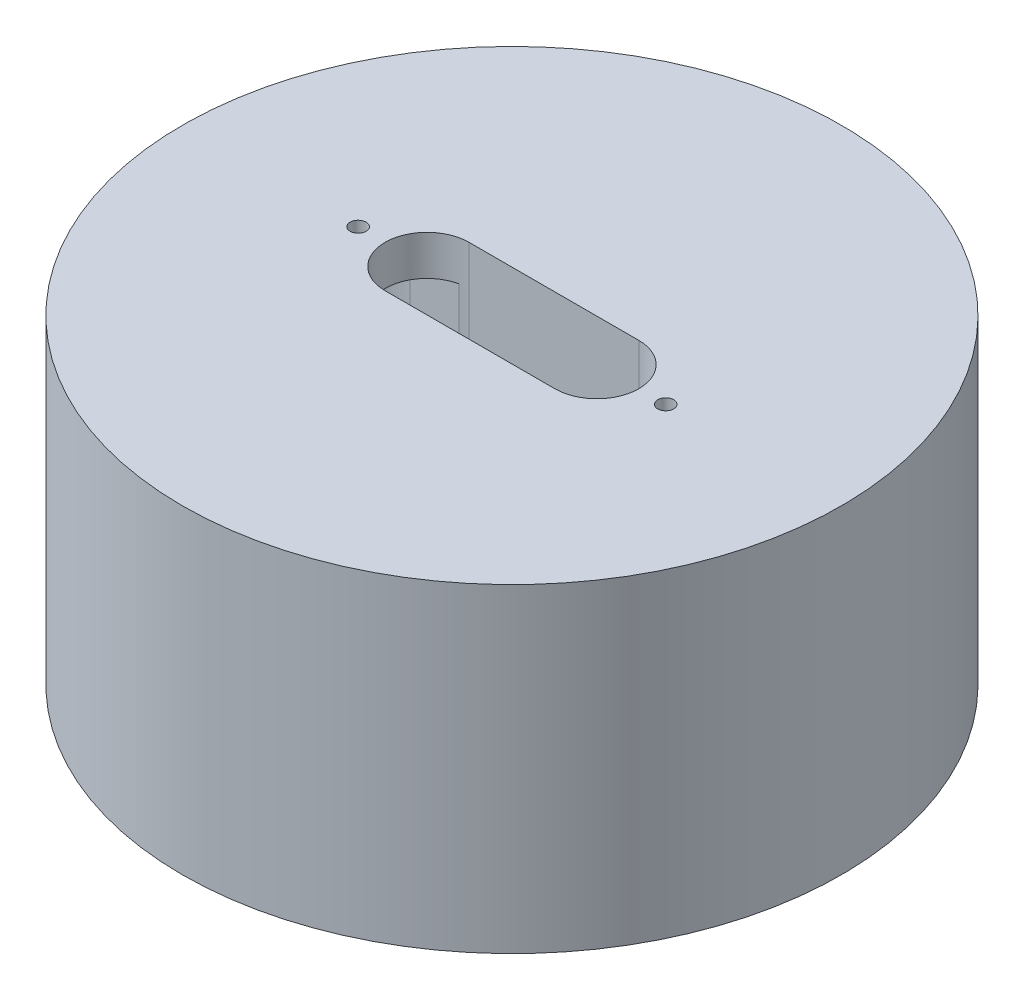
ISO-10303-21;
HEADER;
FILE_DESCRIPTION(('STEP AP214'),'2;1');
FILE_NAME('part.step','',(''),(''),'','','');
FILE_SCHEMA(('AUTOMOTIVE_DESIGN { 1 0 10303 214 1 1 1 1 }'));
ENDSEC;
DATA;
#1=APPLICATION_CONTEXT('core data for automotive mechanical design processes');
#2=APPLICATION_PROTOCOL_DEFINITION('international standard','automotive_design',2000,#1);
#3=PRODUCT_CONTEXT('',#1,'mechanical');
#4=PRODUCT('Part','Part','',(#3));
#5=PRODUCT_RELATED_PRODUCT_CATEGORY('part','',(#4));
#6=PRODUCT_DEFINITION_FORMATION('','',#4);
#7=PRODUCT_DEFINITION_CONTEXT('part definition',#1,'design');
#8=PRODUCT_DEFINITION('design','',#6,#7);
#9=PRODUCT_DEFINITION_SHAPE('','',#8);
#10=(LENGTH_UNIT() NAMED_UNIT(*) SI_UNIT(.MILLI.,.METRE.));
#11=(NAMED_UNIT(*) PLANE_ANGLE_UNIT() SI_UNIT($,.RADIAN.));
#12=(NAMED_UNIT(*) SI_UNIT($,.STERADIAN.) SOLID_ANGLE_UNIT());
#13=UNCERTAINTY_MEASURE_WITH_UNIT(LENGTH_MEASURE(1.E-05),#10,'distance_accuracy_value','');
#14=(GEOMETRIC_REPRESENTATION_CONTEXT(3) GLOBAL_UNCERTAINTY_ASSIGNED_CONTEXT((#13)) GLOBAL_UNIT_ASSIGNED_CONTEXT((#10,
#11,#12)) REPRESENTATION_CONTEXT('',''));
#15=CARTESIAN_POINT('',(0.,0.,0.));
#16=DIRECTION('',(0.,0.,1.));
#17=DIRECTION('',(1.,0.,0.));
#18=AXIS2_PLACEMENT_3D('',#15,#16,#17);
#19=CARTESIAN_POINT('',(0.,0.,0.));
#20=DIRECTION('',(0.,1.,0.));
#21=DIRECTION('',(0.,0.,1.));
#22=AXIS2_PLACEMENT_3D('',#19,#20,#21);
#23=PLANE('',#22);
#24=CARTESIAN_POINT('',(0.,0.,0.));
#25=DIRECTION('',(0.,1.,0.));
#26=DIRECTION('',(0.,0.,1.));
#27=AXIS2_PLACEMENT_3D('',#24,#25,#26);
#28=CIRCLE('',#27,16.5);
#29=CARTESIAN_POINT('',(0.,0.,16.5));
#30=VERTEX_POINT('',#29);
#31=EDGE_CURVE('E331',#30,#30,#28,.T.);
#32=ORIENTED_EDGE('',*,*,#31,.F.);
#33=EDGE_LOOP('',(#32));
#34=FACE_BOUND('',#33,.T.);
#35=CARTESIAN_POINT('',(15.,0.,0.));
#36=DIRECTION('',(0.,-1.,0.));
#37=DIRECTION('',(0.,0.,-1.));
#38=AXIS2_PLACEMENT_3D('',#35,#36,#37);
#39=CIRCLE('',#38,0.4);
#40=CARTESIAN_POINT('',(15.,0.,-0.4));
#41=VERTEX_POINT('',#40);
#42=EDGE_CURVE('E229',#41,#41,#39,.T.);
#43=ORIENTED_EDGE('',*,*,#42,.F.);
#44=EDGE_LOOP('',(#43));
#45=FACE_BOUND('',#44,.T.);
#46=CARTESIAN_POINT('',(1.57300357267813E-13,0.,15.));
#47=DIRECTION('',(0.,-1.,0.));
#48=DIRECTION('',(1.,0.,0.));
#49=AXIS2_PLACEMENT_3D('',#46,#47,#48);
#50=CIRCLE('',#49,0.4);
#51=CARTESIAN_POINT('',(0.400000000000157,0.,15.));
#52=VERTEX_POINT('',#51);
#53=EDGE_CURVE('E225',#52,#52,#50,.T.);
#54=ORIENTED_EDGE('',*,*,#53,.F.);
#55=EDGE_LOOP('',(#54));
#56=FACE_BOUND('',#55,.T.);
#57=CARTESIAN_POINT('',(-15.,0.,0.));
#58=DIRECTION('',(0.,-1.,0.));
#59=DIRECTION('',(0.,0.,1.));
#60=AXIS2_PLACEMENT_3D('',#57,#58,#59);
#61=CIRCLE('',#60,0.4);
#62=CARTESIAN_POINT('',(-15.,0.,0.4));
#63=VERTEX_POINT('',#62);
#64=EDGE_CURVE('E236',#63,#63,#61,.T.);
#65=ORIENTED_EDGE('',*,*,#64,.F.);
#66=EDGE_LOOP('',(#65));
#67=FACE_BOUND('',#66,.T.);
#68=CARTESIAN_POINT('',(0.,0.,-15.));
#69=DIRECTION('',(0.,-1.,0.));
#70=DIRECTION('',(-1.,0.,0.));
#71=AXIS2_PLACEMENT_3D('',#68,#69,#70);
#72=CIRCLE('',#71,0.4);
#73=CARTESIAN_POINT('',(-0.400000000000052,0.,-15.));
#74=VERTEX_POINT('',#73);
#75=EDGE_CURVE('E230',#74,#74,#72,.T.);
#76=ORIENTED_EDGE('',*,*,#75,.F.);
#77=EDGE_LOOP('',(#76));
#78=FACE_BOUND('',#77,.T.);
#79=DIRECTION('',(-0.984807753012208,0.,0.173648177666931));
#80=VECTOR('',#79,1.);
#81=CARTESIAN_POINT('',(0.,0.,0.));
#82=LINE('',#81,#80);
#83=CARTESIAN_POINT('',(-14.033510480424,0.,2.47448653175376));
#84=VERTEX_POINT('',#83);
#85=CARTESIAN_POINT('',(-15.0183182334362,0.,2.64813470942069));
#86=VERTEX_POINT('',#85);
#87=EDGE_CURVE('E196',#84,#86,#82,.T.);
#88=ORIENTED_EDGE('',*,*,#87,.T.);
#89=CARTESIAN_POINT('',(0.,0.,0.));
#90=DIRECTION('',(0.,-1.,0.));
#91=DIRECTION('',(0.,0.,-1.));
#92=AXIS2_PLACEMENT_3D('',#89,#90,#91);
#93=CIRCLE('',#92,15.25);
#94=CARTESIAN_POINT('',(-2.6481347094207,0.,15.0183182334362));
#95=VERTEX_POINT('',#94);
#96=EDGE_CURVE('E195',#95,#86,#93,.T.);
#97=ORIENTED_EDGE('',*,*,#96,.F.);
#98=DIRECTION('',(-0.173648177666931,0.,0.984807753012208));
#99=VECTOR('',#98,1.);
#100=CARTESIAN_POINT('',(0.,0.,0.));
#101=LINE('',#100,#99);
#102=CARTESIAN_POINT('',(-2.47448653175377,0.,14.033510480424));
#103=VERTEX_POINT('',#102);
#104=EDGE_CURVE('E184',#103,#95,#101,.T.);
#105=ORIENTED_EDGE('',*,*,#104,.F.);
#106=CARTESIAN_POINT('',(0.,0.,0.));
#107=DIRECTION('',(0.,-1.,0.));
#108=DIRECTION('',(0.,0.,-1.));
#109=AXIS2_PLACEMENT_3D('',#106,#107,#108);
#110=CIRCLE('',#109,14.25);
#111=EDGE_CURVE('E325',#84,#103,#110,.T.);
#112=ORIENTED_EDGE('',*,*,#111,.F.);
#113=EDGE_LOOP('',(#88,#97,#105,#112));
#114=FACE_BOUND('',#113,.T.);
#115=ADVANCED_FACE('F58',(#34,#45,#56,#67,#78,#114),#23,.F.);
#116=CARTESIAN_POINT('',(0.,5.1,0.));
#117=DIRECTION('',(0.,-1.,0.));
#118=DIRECTION('',(0.,0.,-1.));
#119=AXIS2_PLACEMENT_3D('',#116,#117,#118);
#120=CYLINDRICAL_SURFACE('',#119,14.25);
#121=DIRECTION('',(0.,-1.,0.));
#122=VECTOR('',#121,1.);
#123=CARTESIAN_POINT('',(-14.033510480424,5.1,2.47448653175376));
#124=LINE('',#123,#122);
#125=CARTESIAN_POINT('',(-14.033510480424,5.1,2.47448653175376));
#126=VERTEX_POINT('',#125);
#127=EDGE_CURVE('E223',#84,#126,#124,.F.);
#128=ORIENTED_EDGE('',*,*,#127,.F.);
#129=ORIENTED_EDGE('',*,*,#111,.T.);
#130=DIRECTION('',(0.,-1.,0.));
#131=VECTOR('',#130,1.);
#132=CARTESIAN_POINT('',(-2.47448653175377,5.1,14.033510480424));
#133=LINE('',#132,#131);
#134=CARTESIAN_POINT('',(-2.47448653175377,5.1,14.033510480424));
#135=VERTEX_POINT('',#134);
#136=EDGE_CURVE('E190',#103,#135,#133,.F.);
#137=ORIENTED_EDGE('',*,*,#136,.T.);
#138=CARTESIAN_POINT('',(0.,5.1,0.));
#139=DIRECTION('',(0.,-1.,0.));
#140=DIRECTION('',(0.,0.,-1.));
#141=AXIS2_PLACEMENT_3D('',#138,#139,#140);
#142=CIRCLE('',#141,14.25);
#143=EDGE_CURVE('E328',#126,#135,#142,.T.);
#144=ORIENTED_EDGE('',*,*,#143,.F.);
#145=EDGE_LOOP('',(#128,#129,#137,#144));
#146=FACE_BOUND('',#145,.T.);
#147=ADVANCED_FACE('F411',(#146),#120,.F.);
#148=CARTESIAN_POINT('',(0.,5.1,0.));
#149=DIRECTION('',(0.,-1.,0.));
#150=DIRECTION('',(0.,0.,-1.));
#151=AXIS2_PLACEMENT_3D('',#148,#149,#150);
#152=PLANE('',#151);
#153=CARTESIAN_POINT('',(0.,5.1,0.));
#154=DIRECTION('',(0.,-1.,0.));
#155=DIRECTION('',(0.,0.,-1.));
#156=AXIS2_PLACEMENT_3D('',#153,#154,#155);
#157=CIRCLE('',#156,9.5);
#158=CARTESIAN_POINT('',(-9.35567365361598,5.1,1.64965768783584));
#159=VERTEX_POINT('',#158);
#160=CARTESIAN_POINT('',(-1.64965768783585,5.1,9.35567365361598));
#161=VERTEX_POINT('',#160);
#162=EDGE_CURVE('E314',#159,#161,#157,.T.);
#163=ORIENTED_EDGE('',*,*,#162,.F.);
#164=DIRECTION('',(-0.984807753012208,0.,0.173648177666931));
#165=VECTOR('',#164,1.);
#166=CARTESIAN_POINT('',(0.,5.1,0.));
#167=LINE('',#166,#165);
#168=EDGE_CURVE('E220',#159,#126,#167,.T.);
#169=ORIENTED_EDGE('',*,*,#168,.T.);
#170=ORIENTED_EDGE('',*,*,#143,.T.);
#171=DIRECTION('',(-0.173648177666931,0.,0.984807753012208));
#172=VECTOR('',#171,1.);
#173=CARTESIAN_POINT('',(0.,5.1,0.));
#174=LINE('',#173,#172);
#175=EDGE_CURVE('E215',#161,#135,#174,.T.);
#176=ORIENTED_EDGE('',*,*,#175,.F.);
#177=EDGE_LOOP('',(#163,#169,#170,#176));
#178=FACE_BOUND('',#177,.T.);
#179=ADVANCED_FACE('F416',(#178),#152,.T.);
#180=CARTESIAN_POINT('',(0.,10.1,0.));
#181=DIRECTION('',(0.,-1.,0.));
#182=DIRECTION('',(0.,0.,-1.));
#183=AXIS2_PLACEMENT_3D('',#180,#181,#182);
#184=CYLINDRICAL_SURFACE('',#183,9.5);
#185=DIRECTION('',(0.,-1.,0.));
#186=VECTOR('',#185,1.);
#187=CARTESIAN_POINT('',(-9.35567365361598,10.1,1.64965768783584));
#188=LINE('',#187,#186);
#189=CARTESIAN_POINT('',(-9.35567365361598,10.1,1.64965768783584));
#190=VERTEX_POINT('',#189);
#191=EDGE_CURVE('E218',#159,#190,#188,.F.);
#192=ORIENTED_EDGE('',*,*,#191,.F.);
#193=ORIENTED_EDGE('',*,*,#162,.T.);
#194=DIRECTION('',(0.,-1.,0.));
#195=VECTOR('',#194,1.);
#196=CARTESIAN_POINT('',(-1.64965768783585,10.1,9.35567365361598));
#197=LINE('',#196,#195);
#198=CARTESIAN_POINT('',(-1.64965768783585,10.1,9.35567365361598));
#199=VERTEX_POINT('',#198);
#200=EDGE_CURVE('E212',#161,#199,#197,.F.);
#201=ORIENTED_EDGE('',*,*,#200,.T.);
#202=CARTESIAN_POINT('',(0.,10.1,0.));
#203=DIRECTION('',(0.,-1.,0.));
#204=DIRECTION('',(0.,0.,-1.));
#205=AXIS2_PLACEMENT_3D('',#202,#203,#204);
#206=CIRCLE('',#205,9.5);
#207=EDGE_CURVE('E323',#190,#199,#206,.T.);
#208=ORIENTED_EDGE('',*,*,#207,.F.);
#209=EDGE_LOOP('',(#192,#193,#201,#208));
#210=FACE_BOUND('',#209,.T.);
#211=ADVANCED_FACE('F427',(#210),#184,.F.);
#212=CARTESIAN_POINT('',(0.,16.,0.));
#213=DIRECTION('',(0.,-1.,0.));
#214=DIRECTION('',(0.,0.,-1.));
#215=AXIS2_PLACEMENT_3D('',#212,#213,#214);
#216=CYLINDRICAL_SURFACE('',#215,16.5);
#217=CARTESIAN_POINT('',(0.,16.,0.));
#218=DIRECTION('',(0.,1.,0.));
#219=DIRECTION('',(0.,0.,1.));
#220=AXIS2_PLACEMENT_3D('',#217,#218,#219);
#221=CIRCLE('',#220,16.5);
#222=CARTESIAN_POINT('',(0.,16.,16.5));
#223=VERTEX_POINT('',#222);
#224=EDGE_CURVE('E333',#223,#223,#221,.T.);
#225=ORIENTED_EDGE('',*,*,#224,.F.);
#226=EDGE_LOOP('',(#225));
#227=FACE_BOUND('',#226,.T.);
#228=ORIENTED_EDGE('',*,*,#31,.T.);
#229=EDGE_LOOP('',(#228));
#230=FACE_BOUND('',#229,.T.);
#231=ADVANCED_FACE('F60',(#227,#230),#216,.T.);
#232=CARTESIAN_POINT('',(0.,16.,0.));
#233=DIRECTION('',(0.,1.,0.));
#234=DIRECTION('',(0.,0.,1.));
#235=AXIS2_PLACEMENT_3D('',#232,#233,#234);
#236=PLANE('',#235);
#237=CARTESIAN_POINT('',(7.7,16.,0.));
#238=DIRECTION('',(0.,-1.,0.));
#239=DIRECTION('',(0.,0.,-1.));
#240=AXIS2_PLACEMENT_3D('',#237,#238,#239);
#241=CIRCLE('',#240,0.4);
#242=CARTESIAN_POINT('',(7.7,16.,-0.399999999999998));
#243=VERTEX_POINT('',#242);
#244=EDGE_CURVE('E250',#243,#243,#241,.T.);
#245=ORIENTED_EDGE('',*,*,#244,.T.);
#246=EDGE_LOOP('',(#245));
#247=FACE_BOUND('',#246,.T.);
#248=CARTESIAN_POINT('',(-7.7,16.,0.));
#249=DIRECTION('',(0.,-1.,0.));
#250=DIRECTION('',(0.,0.,-1.));
#251=AXIS2_PLACEMENT_3D('',#248,#249,#250);
#252=CIRCLE('',#251,0.4);
#253=CARTESIAN_POINT('',(-7.7,16.,-0.399999999999999));
#254=VERTEX_POINT('',#253);
#255=EDGE_CURVE('E247',#254,#254,#252,.T.);
#256=ORIENTED_EDGE('',*,*,#255,.T.);
#257=EDGE_LOOP('',(#256));
#258=FACE_BOUND('',#257,.T.);
#259=CARTESIAN_POINT('',(-4.25,16.,0.));
#260=DIRECTION('',(0.,-1.,0.));
#261=DIRECTION('',(0.,0.,-1.));
#262=AXIS2_PLACEMENT_3D('',#259,#260,#261);
#263=CIRCLE('',#262,2.1);
#264=CARTESIAN_POINT('',(-4.25,16.,2.1));
#265=VERTEX_POINT('',#264);
#266=CARTESIAN_POINT('',(-4.25,16.,-2.1));
#267=VERTEX_POINT('',#266);
#268=EDGE_CURVE('E299',#265,#267,#263,.T.);
#269=ORIENTED_EDGE('',*,*,#268,.T.);
#270=DIRECTION('',(-1.,0.,0.));
#271=VECTOR('',#270,1.);
#272=CARTESIAN_POINT('',(0.,16.,-2.1));
#273=LINE('',#272,#271);
#274=CARTESIAN_POINT('',(4.25,16.,-2.1));
#275=VERTEX_POINT('',#274);
#276=EDGE_CURVE('E302',#275,#267,#273,.T.);
#277=ORIENTED_EDGE('',*,*,#276,.F.);
#278=CARTESIAN_POINT('',(4.25,16.,0.));
#279=DIRECTION('',(0.,-1.,0.));
#280=DIRECTION('',(0.,0.,-1.));
#281=AXIS2_PLACEMENT_3D('',#278,#279,#280);
#282=CIRCLE('',#281,2.1);
#283=CARTESIAN_POINT('',(4.25,16.,2.1));
#284=VERTEX_POINT('',#283);
#285=EDGE_CURVE('E304',#275,#284,#282,.T.);
#286=ORIENTED_EDGE('',*,*,#285,.T.);
#287=DIRECTION('',(-1.,0.,0.));
#288=VECTOR('',#287,1.);
#289=CARTESIAN_POINT('',(0.,16.,2.1));
#290=LINE('',#289,#288);
#291=EDGE_CURVE('E307',#284,#265,#290,.T.);
#292=ORIENTED_EDGE('',*,*,#291,.T.);
#293=EDGE_LOOP('',(#269,#277,#286,#292));
#294=FACE_BOUND('',#293,.T.);
#295=ORIENTED_EDGE('',*,*,#224,.T.);
#296=EDGE_LOOP('',(#295));
#297=FACE_BOUND('',#296,.T.);
#298=ADVANCED_FACE('F380',(#247,#258,#294,#297),#236,.T.);
#299=CARTESIAN_POINT('',(0.,10.1,0.));
#300=DIRECTION('',(0.,-1.,0.));
#301=DIRECTION('',(0.,0.,-1.));
#302=AXIS2_PLACEMENT_3D('',#299,#300,#301);
#303=PLANE('',#302);
#304=ORIENTED_EDGE('',*,*,#207,.T.);
#305=DIRECTION('',(0.173648177666931,0.,-0.984807753012208));
#306=VECTOR('',#305,1.);
#307=CARTESIAN_POINT('',(0.,10.1,0.));
#308=LINE('',#307,#306);
#309=CARTESIAN_POINT('',(-2.6481347094207,10.1,15.0183182334362));
#310=VERTEX_POINT('',#309);
#311=EDGE_CURVE('E210',#310,#199,#308,.T.);
#312=ORIENTED_EDGE('',*,*,#311,.F.);
#313=CARTESIAN_POINT('',(0.,10.1,0.));
#314=DIRECTION('',(0.,-1.,0.));
#315=DIRECTION('',(0.,0.,-1.));
#316=AXIS2_PLACEMENT_3D('',#313,#314,#315);
#317=CIRCLE('',#316,15.25);
#318=CARTESIAN_POINT('',(-15.0183182334362,10.1,2.64813470942069));
#319=VERTEX_POINT('',#318);
#320=EDGE_CURVE('E203',#319,#310,#317,.F.);
#321=ORIENTED_EDGE('',*,*,#320,.F.);
#322=DIRECTION('',(0.984807753012208,0.,-0.173648177666931));
#323=VECTOR('',#322,1.);
#324=CARTESIAN_POINT('',(0.,10.1,0.));
#325=LINE('',#324,#323);
#326=EDGE_CURVE('E73',#319,#190,#325,.T.);
#327=ORIENTED_EDGE('',*,*,#326,.T.);
#328=EDGE_LOOP('',(#304,#312,#321,#327));
#329=FACE_BOUND('',#328,.T.);
#330=DIRECTION('',(-1.,0.,0.));
#331=VECTOR('',#330,1.);
#332=CARTESIAN_POINT('',(0.,10.1,-2.05));
#333=LINE('',#332,#331);
#334=CARTESIAN_POINT('',(-4.70552167895722,10.1,-2.05));
#335=VERTEX_POINT('',#334);
#336=CARTESIAN_POINT('',(-7.15,10.1,-2.05));
#337=VERTEX_POINT('',#336);
#338=EDGE_CURVE('E81',#335,#337,#333,.T.);
#339=ORIENTED_EDGE('',*,*,#338,.T.);
#340=CARTESIAN_POINT('',(-7.15,10.1,0.));
#341=DIRECTION('',(0.,-1.,0.));
#342=DIRECTION('',(0.,0.,-1.));
#343=AXIS2_PLACEMENT_3D('',#340,#341,#342);
#344=CIRCLE('',#343,2.05);
#345=CARTESIAN_POINT('',(-7.15,10.1,2.05));
#346=VERTEX_POINT('',#345);
#347=EDGE_CURVE('E66',#346,#337,#344,.T.);
#348=ORIENTED_EDGE('',*,*,#347,.F.);
#349=DIRECTION('',(-1.,0.,0.));
#350=VECTOR('',#349,1.);
#351=CARTESIAN_POINT('',(0.,10.1,2.05));
#352=LINE('',#351,#350);
#353=CARTESIAN_POINT('',(-4.70552167895721,10.1,2.05));
#354=VERTEX_POINT('',#353);
#355=EDGE_CURVE('E293',#354,#346,#352,.T.);
#356=ORIENTED_EDGE('',*,*,#355,.F.);
#357=CARTESIAN_POINT('',(-4.25,10.1,0.));
#358=DIRECTION('',(0.,-1.,0.));
#359=DIRECTION('',(0.,0.,-1.));
#360=AXIS2_PLACEMENT_3D('',#357,#358,#359);
#361=CIRCLE('',#360,2.1);
#362=CARTESIAN_POINT('',(-4.25,10.1,2.1));
#363=VERTEX_POINT('',#362);
#364=EDGE_CURVE('E348',#363,#354,#361,.T.);
#365=ORIENTED_EDGE('',*,*,#364,.F.);
#366=DIRECTION('',(-1.,0.,0.));
#367=VECTOR('',#366,1.);
#368=CARTESIAN_POINT('',(0.,10.1,2.1));
#369=LINE('',#368,#367);
#370=CARTESIAN_POINT('',(4.25,10.1,2.1));
#371=VERTEX_POINT('',#370);
#372=EDGE_CURVE('E345',#371,#363,#369,.T.);
#373=ORIENTED_EDGE('',*,*,#372,.F.);
#374=CARTESIAN_POINT('',(4.25,10.1,0.));
#375=DIRECTION('',(0.,-1.,0.));
#376=DIRECTION('',(0.,0.,-1.));
#377=AXIS2_PLACEMENT_3D('',#374,#375,#376);
#378=CIRCLE('',#377,2.1);
#379=CARTESIAN_POINT('',(4.70552167895721,10.1,2.05));
#380=VERTEX_POINT('',#379);
#381=EDGE_CURVE('E341',#380,#371,#378,.T.);
#382=ORIENTED_EDGE('',*,*,#381,.F.);
#383=CARTESIAN_POINT('',(7.15,10.1,2.05));
#384=VERTEX_POINT('',#383);
#385=EDGE_CURVE('E290',#384,#380,#352,.T.);
#386=ORIENTED_EDGE('',*,*,#385,.F.);
#387=CARTESIAN_POINT('',(7.15,10.1,0.));
#388=DIRECTION('',(0.,-1.,0.));
#389=DIRECTION('',(0.,0.,-1.));
#390=AXIS2_PLACEMENT_3D('',#387,#388,#389);
#391=CIRCLE('',#390,2.05);
#392=CARTESIAN_POINT('',(7.15,10.1,-2.05));
#393=VERTEX_POINT('',#392);
#394=EDGE_CURVE('E13',#393,#384,#391,.T.);
#395=ORIENTED_EDGE('',*,*,#394,.F.);
#396=CARTESIAN_POINT('',(4.70552167895722,10.1,-2.05));
#397=VERTEX_POINT('',#396);
#398=EDGE_CURVE('E271',#393,#397,#333,.T.);
#399=ORIENTED_EDGE('',*,*,#398,.T.);
#400=CARTESIAN_POINT('',(4.25,10.1,-2.1));
#401=VERTEX_POINT('',#400);
#402=EDGE_CURVE('E342',#401,#397,#378,.T.);
#403=ORIENTED_EDGE('',*,*,#402,.F.);
#404=DIRECTION('',(-1.,0.,0.));
#405=VECTOR('',#404,1.);
#406=CARTESIAN_POINT('',(0.,10.1,-2.1));
#407=LINE('',#406,#405);
#408=CARTESIAN_POINT('',(-4.25,10.1,-2.1));
#409=VERTEX_POINT('',#408);
#410=EDGE_CURVE('E336',#401,#409,#407,.T.);
#411=ORIENTED_EDGE('',*,*,#410,.T.);
#412=EDGE_CURVE('E347',#335,#409,#361,.T.);
#413=ORIENTED_EDGE('',*,*,#412,.F.);
#414=EDGE_LOOP('',(#339,#348,#356,#365,#373,#382,#386,#395,#399,#403,#411,#413));
#415=FACE_BOUND('',#414,.T.);
#416=ADVANCED_FACE('F369',(#329,#415),#303,.T.);
#417=CARTESIAN_POINT('',(-4.25,16.,0.));
#418=DIRECTION('',(0.,-1.,0.));
#419=DIRECTION('',(0.,0.,-1.));
#420=AXIS2_PLACEMENT_3D('',#417,#418,#419);
#421=CYLINDRICAL_SURFACE('',#420,2.1);
#422=ORIENTED_EDGE('',*,*,#364,.T.);
#423=DIRECTION('',(0.,-1.,0.));
#424=VECTOR('',#423,1.);
#425=CARTESIAN_POINT('',(-4.70552167895721,16.,2.05));
#426=LINE('',#425,#424);
#427=CARTESIAN_POINT('',(-4.70552167895721,14.,2.05));
#428=VERTEX_POINT('',#427);
#429=EDGE_CURVE('E292',#354,#428,#426,.F.);
#430=ORIENTED_EDGE('',*,*,#429,.T.);
#431=CARTESIAN_POINT('',(-4.25,14.,0.));
#432=DIRECTION('',(0.,1.,0.));
#433=DIRECTION('',(0.,0.,1.));
#434=AXIS2_PLACEMENT_3D('',#431,#432,#433);
#435=CIRCLE('',#434,2.1);
#436=CARTESIAN_POINT('',(-4.70552167895722,14.,-2.05));
#437=VERTEX_POINT('',#436);
#438=EDGE_CURVE('E296',#428,#437,#435,.F.);
#439=ORIENTED_EDGE('',*,*,#438,.T.);
#440=DIRECTION('',(0.,-1.,0.));
#441=VECTOR('',#440,1.);
#442=CARTESIAN_POINT('',(-4.70552167895722,16.,-2.05));
#443=LINE('',#442,#441);
#444=EDGE_CURVE('E288',#335,#437,#443,.F.);
#445=ORIENTED_EDGE('',*,*,#444,.F.);
#446=ORIENTED_EDGE('',*,*,#412,.T.);
#447=DIRECTION('',(0.,-1.,0.));
#448=VECTOR('',#447,1.);
#449=CARTESIAN_POINT('',(-4.25,16.,-2.1));
#450=LINE('',#449,#448);
#451=EDGE_CURVE('E310',#267,#409,#450,.T.);
#452=ORIENTED_EDGE('',*,*,#451,.F.);
#453=ORIENTED_EDGE('',*,*,#268,.F.);
#454=DIRECTION('',(0.,-1.,0.));
#455=VECTOR('',#454,1.);
#456=CARTESIAN_POINT('',(-4.25,16.,2.1));
#457=LINE('',#456,#455);
#458=EDGE_CURVE('E311',#265,#363,#457,.T.);
#459=ORIENTED_EDGE('',*,*,#458,.T.);
#460=EDGE_LOOP('',(#422,#430,#439,#445,#446,#452,#453,#459));
#461=FACE_BOUND('',#460,.T.);
#462=ADVANCED_FACE('F373',(#461),#421,.F.);
#463=CARTESIAN_POINT('',(0.,16.,2.1));
#464=DIRECTION('',(0.,0.,1.));
#465=DIRECTION('',(1.,0.,0.));
#466=AXIS2_PLACEMENT_3D('',#463,#464,#465);
#467=PLANE('',#466);
#468=ORIENTED_EDGE('',*,*,#372,.T.);
#469=ORIENTED_EDGE('',*,*,#458,.F.);
#470=ORIENTED_EDGE('',*,*,#291,.F.);
#471=DIRECTION('',(0.,-1.,0.));
#472=VECTOR('',#471,1.);
#473=CARTESIAN_POINT('',(4.25,16.,2.1));
#474=LINE('',#473,#472);
#475=EDGE_CURVE('E315',#284,#371,#474,.T.);
#476=ORIENTED_EDGE('',*,*,#475,.T.);
#477=EDGE_LOOP('',(#468,#469,#470,#476));
#478=FACE_BOUND('',#477,.T.);
#479=ADVANCED_FACE('F436',(#478),#467,.F.);
#480=CARTESIAN_POINT('',(4.25,16.,0.));
#481=DIRECTION('',(0.,-1.,0.));
#482=DIRECTION('',(0.,0.,-1.));
#483=AXIS2_PLACEMENT_3D('',#480,#481,#482);
#484=CYLINDRICAL_SURFACE('',#483,2.1);
#485=CARTESIAN_POINT('',(4.25,14.,0.));
#486=DIRECTION('',(0.,1.,0.));
#487=DIRECTION('',(0.,0.,1.));
#488=AXIS2_PLACEMENT_3D('',#485,#486,#487);
#489=CIRCLE('',#488,2.1);
#490=CARTESIAN_POINT('',(4.70552167895722,14.,-2.05));
#491=VERTEX_POINT('',#490);
#492=CARTESIAN_POINT('',(4.70552167895721,14.,2.05));
#493=VERTEX_POINT('',#492);
#494=EDGE_CURVE('E353',#491,#493,#489,.F.);
#495=ORIENTED_EDGE('',*,*,#494,.T.);
#496=DIRECTION('',(0.,-1.,0.));
#497=VECTOR('',#496,1.);
#498=CARTESIAN_POINT('',(4.70552167895721,16.,2.05));
#499=LINE('',#498,#497);
#500=EDGE_CURVE('E356',#493,#380,#499,.T.);
#501=ORIENTED_EDGE('',*,*,#500,.T.);
#502=ORIENTED_EDGE('',*,*,#381,.T.);
#503=ORIENTED_EDGE('',*,*,#475,.F.);
#504=ORIENTED_EDGE('',*,*,#285,.F.);
#505=DIRECTION('',(0.,-1.,0.));
#506=VECTOR('',#505,1.);
#507=CARTESIAN_POINT('',(4.25,16.,-2.1));
#508=LINE('',#507,#506);
#509=EDGE_CURVE('E318',#275,#401,#508,.T.);
#510=ORIENTED_EDGE('',*,*,#509,.T.);
#511=ORIENTED_EDGE('',*,*,#402,.T.);
#512=DIRECTION('',(0.,-1.,0.));
#513=VECTOR('',#512,1.);
#514=CARTESIAN_POINT('',(4.70552167895722,16.,-2.05));
#515=LINE('',#514,#513);
#516=EDGE_CURVE('E351',#491,#397,#515,.T.);
#517=ORIENTED_EDGE('',*,*,#516,.F.);
#518=EDGE_LOOP('',(#495,#501,#502,#503,#504,#510,#511,#517));
#519=FACE_BOUND('',#518,.T.);
#520=ADVANCED_FACE('F439',(#519),#484,.F.);
#521=CARTESIAN_POINT('',(0.,16.,-2.1));
#522=DIRECTION('',(0.,0.,1.));
#523=DIRECTION('',(1.,0.,0.));
#524=AXIS2_PLACEMENT_3D('',#521,#522,#523);
#525=PLANE('',#524);
#526=ORIENTED_EDGE('',*,*,#509,.F.);
#527=ORIENTED_EDGE('',*,*,#276,.T.);
#528=ORIENTED_EDGE('',*,*,#451,.T.);
#529=ORIENTED_EDGE('',*,*,#410,.F.);
#530=EDGE_LOOP('',(#526,#527,#528,#529));
#531=FACE_BOUND('',#530,.T.);
#532=ADVANCED_FACE('F377',(#531),#525,.T.);
#533=CARTESIAN_POINT('',(7.15,30.8761554173113,2.05));
#534=DIRECTION('',(0.,0.,1.));
#535=DIRECTION('',(1.,0.,0.));
#536=AXIS2_PLACEMENT_3D('',#533,#534,#535);
#537=PLANE('',#536);
#538=ORIENTED_EDGE('',*,*,#385,.T.);
#539=ORIENTED_EDGE('',*,*,#500,.F.);
#540=DIRECTION('',(-1.,0.,0.));
#541=VECTOR('',#540,1.);
#542=CARTESIAN_POINT('',(7.15,14.,2.05));
#543=LINE('',#542,#541);
#544=CARTESIAN_POINT('',(7.15,14.,2.05));
#545=VERTEX_POINT('',#544);
#546=EDGE_CURVE('E276',#545,#493,#543,.T.);
#547=ORIENTED_EDGE('',*,*,#546,.F.);
#548=DIRECTION('',(0.,-1.,0.));
#549=VECTOR('',#548,1.);
#550=CARTESIAN_POINT('',(7.15,30.8761554173113,2.05));
#551=LINE('',#550,#549);
#552=EDGE_CURVE('E275',#545,#384,#551,.T.);
#553=ORIENTED_EDGE('',*,*,#552,.T.);
#554=EDGE_LOOP('',(#538,#539,#547,#553));
#555=FACE_BOUND('',#554,.T.);
#556=ADVANCED_FACE('F402',(#555),#537,.F.);
#557=CARTESIAN_POINT('',(7.15,30.8761554173113,-2.05));
#558=DIRECTION('',(0.,0.,1.));
#559=DIRECTION('',(1.,0.,0.));
#560=AXIS2_PLACEMENT_3D('',#557,#558,#559);
#561=PLANE('',#560);
#562=DIRECTION('',(0.,-1.,0.));
#563=VECTOR('',#562,1.);
#564=CARTESIAN_POINT('',(7.15,30.8761554173113,-2.05));
#565=LINE('',#564,#563);
#566=CARTESIAN_POINT('',(7.15,14.,-2.05));
#567=VERTEX_POINT('',#566);
#568=EDGE_CURVE('E266',#567,#393,#565,.T.);
#569=ORIENTED_EDGE('',*,*,#568,.F.);
#570=DIRECTION('',(-1.,0.,0.));
#571=VECTOR('',#570,1.);
#572=CARTESIAN_POINT('',(7.15,14.,-2.05));
#573=LINE('',#572,#571);
#574=EDGE_CURVE('E284',#567,#491,#573,.T.);
#575=ORIENTED_EDGE('',*,*,#574,.T.);
#576=ORIENTED_EDGE('',*,*,#516,.T.);
#577=ORIENTED_EDGE('',*,*,#398,.F.);
#578=EDGE_LOOP('',(#569,#575,#576,#577));
#579=FACE_BOUND('',#578,.T.);
#580=ADVANCED_FACE('F408',(#579),#561,.T.);
#581=CARTESIAN_POINT('',(0.,14.,0.));
#582=DIRECTION('',(0.,1.,0.));
#583=DIRECTION('',(0.,0.,1.));
#584=AXIS2_PLACEMENT_3D('',#581,#582,#583);
#585=PLANE('',#584);
#586=CARTESIAN_POINT('',(7.7,14.,0.));
#587=DIRECTION('',(0.,-1.,0.));
#588=DIRECTION('',(0.,0.,-1.));
#589=AXIS2_PLACEMENT_3D('',#586,#587,#588);
#590=CIRCLE('',#589,0.4);
#591=CARTESIAN_POINT('',(7.7,14.,-0.399999999999998));
#592=VERTEX_POINT('',#591);
#593=EDGE_CURVE('E254',#592,#592,#590,.T.);
#594=ORIENTED_EDGE('',*,*,#593,.F.);
#595=EDGE_LOOP('',(#594));
#596=FACE_BOUND('',#595,.T.);
#597=ORIENTED_EDGE('',*,*,#574,.F.);
#598=CARTESIAN_POINT('',(7.15,14.,0.));
#599=DIRECTION('',(0.,1.,0.));
#600=DIRECTION('',(0.,0.,1.));
#601=AXIS2_PLACEMENT_3D('',#598,#599,#600);
#602=CIRCLE('',#601,2.05);
#603=EDGE_CURVE('E272',#567,#545,#602,.F.);
#604=ORIENTED_EDGE('',*,*,#603,.T.);
#605=ORIENTED_EDGE('',*,*,#546,.T.);
#606=ORIENTED_EDGE('',*,*,#494,.F.);
#607=EDGE_LOOP('',(#597,#604,#605,#606));
#608=FACE_BOUND('',#607,.T.);
#609=ADVANCED_FACE('F396',(#596,#608),#585,.F.);
#610=CARTESIAN_POINT('',(7.15,30.8761554173113,0.));
#611=DIRECTION('',(0.,-1.,0.));
#612=DIRECTION('',(0.,0.,-1.));
#613=AXIS2_PLACEMENT_3D('',#610,#611,#612);
#614=CYLINDRICAL_SURFACE('',#613,2.05);
#615=ORIENTED_EDGE('',*,*,#394,.T.);
#616=ORIENTED_EDGE('',*,*,#552,.F.);
#617=ORIENTED_EDGE('',*,*,#603,.F.);
#618=ORIENTED_EDGE('',*,*,#568,.T.);
#619=EDGE_LOOP('',(#615,#616,#617,#618));
#620=FACE_BOUND('',#619,.T.);
#621=ADVANCED_FACE('F393',(#620),#614,.F.);
#622=CARTESIAN_POINT('',(-7.7,14.,0.));
#623=DIRECTION('',(0.,-1.,0.));
#624=DIRECTION('',(0.,0.,-1.));
#625=AXIS2_PLACEMENT_3D('',#622,#623,#624);
#626=CIRCLE('',#625,0.4);
#627=CARTESIAN_POINT('',(-7.7,14.,-0.399999999999999));
#628=VERTEX_POINT('',#627);
#629=EDGE_CURVE('E257',#628,#628,#626,.T.);
#630=ORIENTED_EDGE('',*,*,#629,.F.);
#631=EDGE_LOOP('',(#630));
#632=FACE_BOUND('',#631,.T.);
#633=CARTESIAN_POINT('',(-7.15,14.,2.05));
#634=VERTEX_POINT('',#633);
#635=EDGE_CURVE('E283',#428,#634,#543,.T.);
#636=ORIENTED_EDGE('',*,*,#635,.T.);
#637=CARTESIAN_POINT('',(-7.15,14.,0.));
#638=DIRECTION('',(0.,1.,0.));
#639=DIRECTION('',(0.,0.,1.));
#640=AXIS2_PLACEMENT_3D('',#637,#638,#639);
#641=CIRCLE('',#640,2.05);
#642=CARTESIAN_POINT('',(-7.15,14.,-2.05));
#643=VERTEX_POINT('',#642);
#644=EDGE_CURVE('E262',#634,#643,#641,.F.);
#645=ORIENTED_EDGE('',*,*,#644,.T.);
#646=EDGE_CURVE('E253',#437,#643,#573,.T.);
#647=ORIENTED_EDGE('',*,*,#646,.F.);
#648=ORIENTED_EDGE('',*,*,#438,.F.);
#649=EDGE_LOOP('',(#636,#645,#647,#648));
#650=FACE_BOUND('',#649,.T.);
#651=ADVANCED_FACE('F391',(#632,#650),#585,.F.);
#652=ORIENTED_EDGE('',*,*,#355,.T.);
#653=DIRECTION('',(0.,-1.,0.));
#654=VECTOR('',#653,1.);
#655=CARTESIAN_POINT('',(-7.15,30.8761554173113,2.05));
#656=LINE('',#655,#654);
#657=EDGE_CURVE('E268',#634,#346,#656,.T.);
#658=ORIENTED_EDGE('',*,*,#657,.F.);
#659=ORIENTED_EDGE('',*,*,#635,.F.);
#660=ORIENTED_EDGE('',*,*,#429,.F.);
#661=EDGE_LOOP('',(#652,#658,#659,#660));
#662=FACE_BOUND('',#661,.T.);
#663=ADVANCED_FACE('F388',(#662),#537,.F.);
#664=ORIENTED_EDGE('',*,*,#444,.T.);
#665=ORIENTED_EDGE('',*,*,#646,.T.);
#666=DIRECTION('',(0.,-1.,0.));
#667=VECTOR('',#666,1.);
#668=CARTESIAN_POINT('',(-7.15,30.8761554173113,-2.05));
#669=LINE('',#668,#667);
#670=EDGE_CURVE('E265',#643,#337,#669,.T.);
#671=ORIENTED_EDGE('',*,*,#670,.T.);
#672=ORIENTED_EDGE('',*,*,#338,.F.);
#673=EDGE_LOOP('',(#664,#665,#671,#672));
#674=FACE_BOUND('',#673,.T.);
#675=ADVANCED_FACE('F366',(#674),#561,.T.);
#676=CARTESIAN_POINT('',(-7.15,30.8761554173113,0.));
#677=DIRECTION('',(0.,-1.,0.));
#678=DIRECTION('',(0.,0.,-1.));
#679=AXIS2_PLACEMENT_3D('',#676,#677,#678);
#680=CYLINDRICAL_SURFACE('',#679,2.05);
#681=ORIENTED_EDGE('',*,*,#347,.T.);
#682=ORIENTED_EDGE('',*,*,#670,.F.);
#683=ORIENTED_EDGE('',*,*,#644,.F.);
#684=ORIENTED_EDGE('',*,*,#657,.T.);
#685=EDGE_LOOP('',(#681,#682,#683,#684));
#686=FACE_BOUND('',#685,.T.);
#687=ADVANCED_FACE('F361',(#686),#680,.F.);
#688=CARTESIAN_POINT('',(-7.7,16.,0.));
#689=DIRECTION('',(0.,-1.,0.));
#690=DIRECTION('',(0.,0.,-1.));
#691=AXIS2_PLACEMENT_3D('',#688,#689,#690);
#692=CYLINDRICAL_SURFACE('',#691,0.4);
#693=ORIENTED_EDGE('',*,*,#255,.F.);
#694=EDGE_LOOP('',(#693));
#695=FACE_BOUND('',#694,.T.);
#696=ORIENTED_EDGE('',*,*,#629,.T.);
#697=EDGE_LOOP('',(#696));
#698=FACE_BOUND('',#697,.T.);
#699=ADVANCED_FACE('F455',(#695,#698),#692,.F.);
#700=CARTESIAN_POINT('',(7.7,16.,0.));
#701=DIRECTION('',(0.,-1.,0.));
#702=DIRECTION('',(0.,0.,-1.));
#703=AXIS2_PLACEMENT_3D('',#700,#701,#702);
#704=CYLINDRICAL_SURFACE('',#703,0.4);
#705=ORIENTED_EDGE('',*,*,#244,.F.);
#706=EDGE_LOOP('',(#705));
#707=FACE_BOUND('',#706,.T.);
#708=ORIENTED_EDGE('',*,*,#593,.T.);
#709=EDGE_LOOP('',(#708));
#710=FACE_BOUND('',#709,.T.);
#711=ADVANCED_FACE('F459',(#707,#710),#704,.F.);
#712=CARTESIAN_POINT('',(15.,3.,0.));
#713=DIRECTION('',(0.,-1.,0.));
#714=DIRECTION('',(0.,0.,-1.));
#715=AXIS2_PLACEMENT_3D('',#712,#713,#714);
#716=CYLINDRICAL_SURFACE('',#715,0.4);
#717=CARTESIAN_POINT('',(15.,3.,0.));
#718=DIRECTION('',(0.,-1.,0.));
#719=DIRECTION('',(0.,0.,-1.));
#720=AXIS2_PLACEMENT_3D('',#717,#718,#719);
#721=CIRCLE('',#720,0.4);
#722=CARTESIAN_POINT('',(15.,3.,-0.4));
#723=VERTEX_POINT('',#722);
#724=EDGE_CURVE('E244',#723,#723,#721,.T.);
#725=ORIENTED_EDGE('',*,*,#724,.F.);
#726=EDGE_LOOP('',(#725));
#727=FACE_BOUND('',#726,.T.);
#728=ORIENTED_EDGE('',*,*,#42,.T.);
#729=EDGE_LOOP('',(#728));
#730=FACE_BOUND('',#729,.T.);
#731=ADVANCED_FACE('F465',(#727,#730),#716,.F.);
#732=CARTESIAN_POINT('',(15.,3.,0.));
#733=DIRECTION('',(0.,-1.,0.));
#734=DIRECTION('',(0.,0.,-1.));
#735=AXIS2_PLACEMENT_3D('',#732,#733,#734);
#736=PLANE('',#735);
#737=ORIENTED_EDGE('',*,*,#724,.T.);
#738=EDGE_LOOP('',(#737));
#739=FACE_BOUND('',#738,.T.);
#740=ADVANCED_FACE('F469',(#739),#736,.T.);
#741=CARTESIAN_POINT('',(1.57300357267813E-13,3.,15.));
#742=DIRECTION('',(0.,-1.,0.));
#743=DIRECTION('',(0.,0.,-1.));
#744=AXIS2_PLACEMENT_3D('',#741,#742,#743);
#745=CYLINDRICAL_SURFACE('',#744,0.4);
#746=CARTESIAN_POINT('',(1.57300357267813E-13,3.,15.));
#747=DIRECTION('',(0.,-1.,0.));
#748=DIRECTION('',(1.,0.,0.));
#749=AXIS2_PLACEMENT_3D('',#746,#747,#748);
#750=CIRCLE('',#749,0.4);
#751=CARTESIAN_POINT('',(0.400000000000157,3.,15.));
#752=VERTEX_POINT('',#751);
#753=EDGE_CURVE('E239',#752,#752,#750,.T.);
#754=ORIENTED_EDGE('',*,*,#753,.F.);
#755=EDGE_LOOP('',(#754));
#756=FACE_BOUND('',#755,.T.);
#757=ORIENTED_EDGE('',*,*,#53,.T.);
#758=EDGE_LOOP('',(#757));
#759=FACE_BOUND('',#758,.T.);
#760=ADVANCED_FACE('F473',(#756,#759),#745,.F.);
#761=CARTESIAN_POINT('',(1.57300357267813E-13,3.,15.));
#762=DIRECTION('',(0.,-1.,0.));
#763=DIRECTION('',(1.,0.,0.));
#764=AXIS2_PLACEMENT_3D('',#761,#762,#763);
#765=PLANE('',#764);
#766=ORIENTED_EDGE('',*,*,#753,.T.);
#767=EDGE_LOOP('',(#766));
#768=FACE_BOUND('',#767,.T.);
#769=ADVANCED_FACE('F477',(#768),#765,.T.);
#770=CARTESIAN_POINT('',(-15.,3.,0.));
#771=DIRECTION('',(0.,-1.,0.));
#772=DIRECTION('',(0.,0.,-1.));
#773=AXIS2_PLACEMENT_3D('',#770,#771,#772);
#774=CYLINDRICAL_SURFACE('',#773,0.4);
#775=CARTESIAN_POINT('',(-15.,3.,0.));
#776=DIRECTION('',(0.,-1.,0.));
#777=DIRECTION('',(0.,0.,1.));
#778=AXIS2_PLACEMENT_3D('',#775,#776,#777);
#779=CIRCLE('',#778,0.4);
#780=CARTESIAN_POINT('',(-15.,3.,0.4));
#781=VERTEX_POINT('',#780);
#782=EDGE_CURVE('E233',#781,#781,#779,.T.);
#783=ORIENTED_EDGE('',*,*,#782,.F.);
#784=EDGE_LOOP('',(#783));
#785=FACE_BOUND('',#784,.T.);
#786=ORIENTED_EDGE('',*,*,#64,.T.);
#787=EDGE_LOOP('',(#786));
#788=FACE_BOUND('',#787,.T.);
#789=ADVANCED_FACE('F481',(#785,#788),#774,.F.);
#790=CARTESIAN_POINT('',(-15.,3.,0.));
#791=DIRECTION('',(0.,-1.,0.));
#792=DIRECTION('',(0.,0.,1.));
#793=AXIS2_PLACEMENT_3D('',#790,#791,#792);
#794=PLANE('',#793);
#795=ORIENTED_EDGE('',*,*,#782,.T.);
#796=EDGE_LOOP('',(#795));
#797=FACE_BOUND('',#796,.T.);
#798=ADVANCED_FACE('F485',(#797),#794,.T.);
#799=CARTESIAN_POINT('',(0.,3.,-15.));
#800=DIRECTION('',(0.,-1.,0.));
#801=DIRECTION('',(0.,0.,-1.));
#802=AXIS2_PLACEMENT_3D('',#799,#800,#801);
#803=CYLINDRICAL_SURFACE('',#802,0.4);
#804=CARTESIAN_POINT('',(0.,3.,-15.));
#805=DIRECTION('',(0.,-1.,0.));
#806=DIRECTION('',(-1.,0.,0.));
#807=AXIS2_PLACEMENT_3D('',#804,#805,#806);
#808=CIRCLE('',#807,0.4);
#809=CARTESIAN_POINT('',(-0.400000000000052,3.,-15.));
#810=VERTEX_POINT('',#809);
#811=EDGE_CURVE('E226',#810,#810,#808,.T.);
#812=ORIENTED_EDGE('',*,*,#811,.F.);
#813=EDGE_LOOP('',(#812));
#814=FACE_BOUND('',#813,.T.);
#815=ORIENTED_EDGE('',*,*,#75,.T.);
#816=EDGE_LOOP('',(#815));
#817=FACE_BOUND('',#816,.T.);
#818=ADVANCED_FACE('F489',(#814,#817),#803,.F.);
#819=CARTESIAN_POINT('',(0.,3.,-15.));
#820=DIRECTION('',(0.,-1.,0.));
#821=DIRECTION('',(-1.,0.,0.));
#822=AXIS2_PLACEMENT_3D('',#819,#820,#821);
#823=PLANE('',#822);
#824=ORIENTED_EDGE('',*,*,#811,.T.);
#825=EDGE_LOOP('',(#824));
#826=FACE_BOUND('',#825,.T.);
#827=ADVANCED_FACE('F493',(#826),#823,.T.);
#828=CARTESIAN_POINT('',(0.,31.3391093297606,0.));
#829=DIRECTION('',(0.173648177666931,0.,0.984807753012208));
#830=DIRECTION('',(0.984807753012208,0.,-0.173648177666931));
#831=AXIS2_PLACEMENT_3D('',#828,#829,#830);
#832=PLANE('',#831);
#833=ORIENTED_EDGE('',*,*,#127,.T.);
#834=ORIENTED_EDGE('',*,*,#168,.F.);
#835=ORIENTED_EDGE('',*,*,#191,.T.);
#836=ORIENTED_EDGE('',*,*,#326,.F.);
#837=DIRECTION('',(0.,-1.,0.));
#838=VECTOR('',#837,1.);
#839=CARTESIAN_POINT('',(-15.0183182334362,31.3391093297606,2.64813470942069));
#840=LINE('',#839,#838);
#841=EDGE_CURVE('E204',#319,#86,#840,.T.);
#842=ORIENTED_EDGE('',*,*,#841,.T.);
#843=ORIENTED_EDGE('',*,*,#87,.F.);
#844=EDGE_LOOP('',(#833,#834,#835,#836,#842,#843));
#845=FACE_BOUND('',#844,.T.);
#846=ADVANCED_FACE('F497',(#845),#832,.T.);
#847=CARTESIAN_POINT('',(0.,31.3391093297606,0.));
#848=DIRECTION('',(0.984807753012208,0.,0.173648177666931));
#849=DIRECTION('',(0.173648177666931,0.,-0.984807753012208));
#850=AXIS2_PLACEMENT_3D('',#847,#848,#849);
#851=PLANE('',#850);
#852=ORIENTED_EDGE('',*,*,#104,.T.);
#853=DIRECTION('',(0.,-1.,0.));
#854=VECTOR('',#853,1.);
#855=CARTESIAN_POINT('',(-2.6481347094207,31.3391093297606,15.0183182334362));
#856=LINE('',#855,#854);
#857=EDGE_CURVE('E187',#310,#95,#856,.T.);
#858=ORIENTED_EDGE('',*,*,#857,.F.);
#859=ORIENTED_EDGE('',*,*,#311,.T.);
#860=ORIENTED_EDGE('',*,*,#200,.F.);
#861=ORIENTED_EDGE('',*,*,#175,.T.);
#862=ORIENTED_EDGE('',*,*,#136,.F.);
#863=EDGE_LOOP('',(#852,#858,#859,#860,#861,#862));
#864=FACE_BOUND('',#863,.T.);
#865=ADVANCED_FACE('F186',(#864),#851,.F.);
#866=CARTESIAN_POINT('',(0.,31.3391093297606,0.));
#867=DIRECTION('',(0.,-1.,0.));
#868=DIRECTION('',(0.,0.,-1.));
#869=AXIS2_PLACEMENT_3D('',#866,#867,#868);
#870=CYLINDRICAL_SURFACE('',#869,15.25);
#871=ORIENTED_EDGE('',*,*,#320,.T.);
#872=ORIENTED_EDGE('',*,*,#857,.T.);
#873=ORIENTED_EDGE('',*,*,#96,.T.);
#874=ORIENTED_EDGE('',*,*,#841,.F.);
#875=EDGE_LOOP('',(#871,#872,#873,#874));
#876=FACE_BOUND('',#875,.T.);
#877=ADVANCED_FACE('F200',(#876),#870,.F.);
#878=CLOSED_SHELL('',(#115,#147,#179,#211,#231,#298,#416,#462,#479,#520,#532,#556,#580,#609,
#621,#651,#663,#675,#687,#699,#711,#731,#740,#760,#769,#789,#798,#818,#827,#846,#865,#877));
#879=MANIFOLD_SOLID_BREP('B2',#878);
#880=ADVANCED_BREP_SHAPE_REPRESENTATION('',(#18,#879),#14);
#881=SHAPE_DEFINITION_REPRESENTATION(#9,#880);
ENDSEC;
END-ISO-10303-21;
